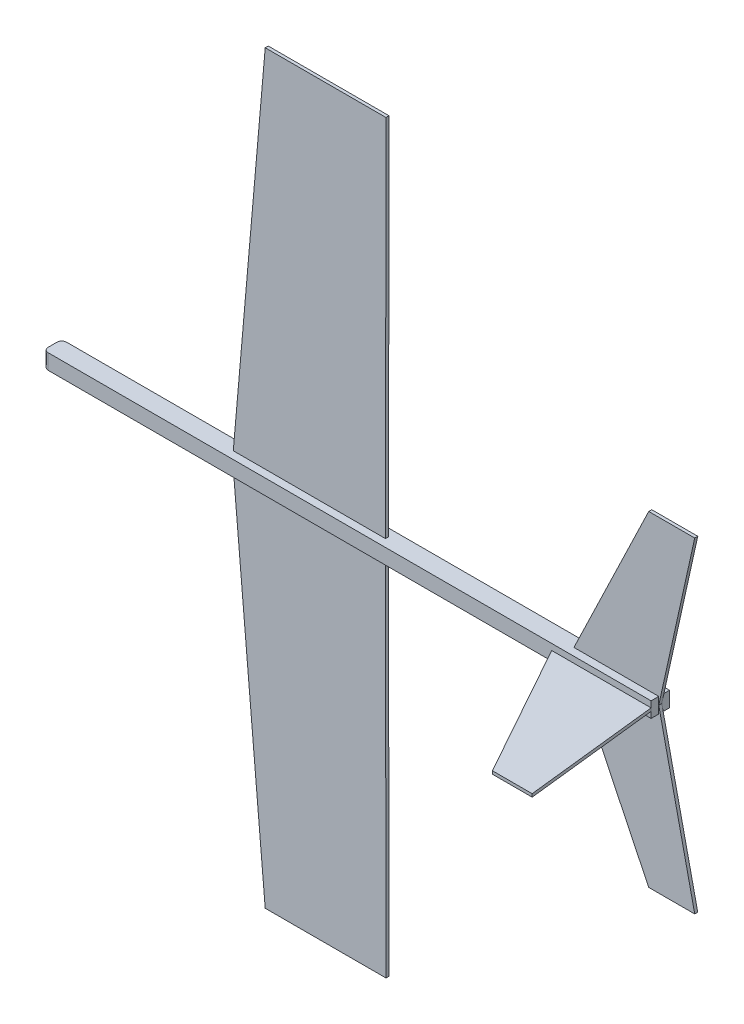
ISO-10303-21;
HEADER;
FILE_DESCRIPTION(('STEP AP214'),'2;1');
FILE_NAME('part.step','',(''),(''),'','','');
FILE_SCHEMA(('AUTOMOTIVE_DESIGN { 1 0 10303 214 1 1 1 1 }'));
ENDSEC;
DATA;
#1=APPLICATION_CONTEXT('core data for automotive mechanical design processes');
#2=APPLICATION_PROTOCOL_DEFINITION('international standard','automotive_design',2000,#1);
#3=PRODUCT_CONTEXT('',#1,'mechanical');
#4=PRODUCT('Part','Part','',(#3));
#5=PRODUCT_RELATED_PRODUCT_CATEGORY('part','',(#4));
#6=PRODUCT_DEFINITION_FORMATION('','',#4);
#7=PRODUCT_DEFINITION_CONTEXT('part definition',#1,'design');
#8=PRODUCT_DEFINITION('design','',#6,#7);
#9=PRODUCT_DEFINITION_SHAPE('','',#8);
#10=(LENGTH_UNIT() NAMED_UNIT(*) SI_UNIT(.MILLI.,.METRE.));
#11=(NAMED_UNIT(*) PLANE_ANGLE_UNIT() SI_UNIT($,.RADIAN.));
#12=(NAMED_UNIT(*) SI_UNIT($,.STERADIAN.) SOLID_ANGLE_UNIT());
#13=UNCERTAINTY_MEASURE_WITH_UNIT(LENGTH_MEASURE(1.E-05),#10,'distance_accuracy_value','');
#14=(GEOMETRIC_REPRESENTATION_CONTEXT(3) GLOBAL_UNCERTAINTY_ASSIGNED_CONTEXT((#13)) GLOBAL_UNIT_ASSIGNED_CONTEXT((#10,
#11,#12)) REPRESENTATION_CONTEXT('',''));
#15=CARTESIAN_POINT('',(0.,0.,0.));
#16=DIRECTION('',(0.,0.,1.));
#17=DIRECTION('',(1.,0.,0.));
#18=AXIS2_PLACEMENT_3D('',#15,#16,#17);
#19=CARTESIAN_POINT('',(159.,4.00000000000003,4.8));
#20=DIRECTION('',(-1.,0.,0.));
#21=DIRECTION('',(0.,0.,1.));
#22=AXIS2_PLACEMENT_3D('',#19,#20,#21);
#23=PLANE('',#22);
#24=DIRECTION('',(0.,1.,0.));
#25=VECTOR('',#24,1.);
#26=CARTESIAN_POINT('',(159.,4.00000000000003,-0.79375));
#27=LINE('',#26,#25);
#28=CARTESIAN_POINT('',(159.,-3.99999999999997,-0.79375));
#29=VERTEX_POINT('',#28);
#30=CARTESIAN_POINT('',(159.,0.,-0.79375));
#31=VERTEX_POINT('',#30);
#32=EDGE_CURVE('E424',#29,#31,#27,.T.);
#33=ORIENTED_EDGE('',*,*,#32,.F.);
#34=DIRECTION('',(0.,0.,-1.));
#35=VECTOR('',#34,1.);
#36=CARTESIAN_POINT('',(159.,-3.99999999999997,4.8));
#37=LINE('',#36,#35);
#38=CARTESIAN_POINT('',(159.,-3.99999999999997,-4.8));
#39=VERTEX_POINT('',#38);
#40=EDGE_CURVE('E388',#29,#39,#37,.T.);
#41=ORIENTED_EDGE('',*,*,#40,.T.);
#42=DIRECTION('',(0.,1.,0.));
#43=VECTOR('',#42,1.);
#44=CARTESIAN_POINT('',(159.,4.00000000000003,-4.8));
#45=LINE('',#44,#43);
#46=CARTESIAN_POINT('',(159.,4.00000000000003,-4.8));
#47=VERTEX_POINT('',#46);
#48=EDGE_CURVE('E378',#39,#47,#45,.T.);
#49=ORIENTED_EDGE('',*,*,#48,.T.);
#50=DIRECTION('',(0.,0.,-1.));
#51=VECTOR('',#50,1.);
#52=CARTESIAN_POINT('',(159.,4.00000000000003,4.8));
#53=LINE('',#52,#51);
#54=CARTESIAN_POINT('',(159.,4.00000000000003,-0.79375));
#55=VERTEX_POINT('',#54);
#56=EDGE_CURVE('E384',#55,#47,#53,.T.);
#57=ORIENTED_EDGE('',*,*,#56,.F.);
#58=DIRECTION('',(0.,1.,0.));
#59=VECTOR('',#58,1.);
#60=CARTESIAN_POINT('',(159.,4.00000000000003,-0.79375));
#61=LINE('',#60,#59);
#62=EDGE_CURVE('E416',#31,#55,#61,.T.);
#63=ORIENTED_EDGE('',*,*,#62,.F.);
#64=EDGE_LOOP('',(#33,#41,#49,#57,#63));
#65=FACE_BOUND('',#64,.T.);
#66=ADVANCED_FACE('F43',(#65),#23,.F.);
#67=CARTESIAN_POINT('',(0.,0.,4.8));
#68=DIRECTION('',(0.,0.,-1.));
#69=DIRECTION('',(-1.,0.,0.));
#70=AXIS2_PLACEMENT_3D('',#67,#68,#69);
#71=PLANE('',#70);
#72=DIRECTION('',(-1.,0.,0.));
#73=VECTOR('',#72,1.);
#74=CARTESIAN_POINT('',(159.,4.00000000000003,4.8));
#75=LINE('',#74,#73);
#76=CARTESIAN_POINT('',(159.,4.00000000000003,4.8));
#77=VERTEX_POINT('',#76);
#78=CARTESIAN_POINT('',(-156.5,4.00000000000007,4.8));
#79=VERTEX_POINT('',#78);
#80=EDGE_CURVE('E374',#77,#79,#75,.T.);
#81=ORIENTED_EDGE('',*,*,#80,.T.);
#82=DIRECTION('',(0.,-1.,0.));
#83=VECTOR('',#82,1.);
#84=CARTESIAN_POINT('',(-156.5,0.,4.8));
#85=LINE('',#84,#83);
#86=CARTESIAN_POINT('',(-156.5,-4.00000000000007,4.8));
#87=VERTEX_POINT('',#86);
#88=EDGE_CURVE('E11',#79,#87,#85,.T.);
#89=ORIENTED_EDGE('',*,*,#88,.T.);
#90=DIRECTION('',(1.,0.,0.));
#91=VECTOR('',#90,1.);
#92=CARTESIAN_POINT('',(159.,-3.99999999999997,4.8));
#93=LINE('',#92,#91);
#94=CARTESIAN_POINT('',(159.,-3.99999999999997,4.8));
#95=VERTEX_POINT('',#94);
#96=EDGE_CURVE('E367',#87,#95,#93,.T.);
#97=ORIENTED_EDGE('',*,*,#96,.T.);
#98=DIRECTION('',(0.,1.,0.));
#99=VECTOR('',#98,1.);
#100=CARTESIAN_POINT('',(159.,4.00000000000003,4.8));
#101=LINE('',#100,#99);
#102=CARTESIAN_POINT('',(159.,-0.79375,4.8));
#103=VERTEX_POINT('',#102);
#104=EDGE_CURVE('E371',#95,#103,#101,.T.);
#105=ORIENTED_EDGE('',*,*,#104,.T.);
#106=DIRECTION('',(1.,0.,0.));
#107=VECTOR('',#106,1.);
#108=CARTESIAN_POINT('',(107.,-0.79375,4.8));
#109=LINE('',#108,#107);
#110=CARTESIAN_POINT('',(107.,-0.79375,4.8));
#111=VERTEX_POINT('',#110);
#112=EDGE_CURVE('E291',#111,#103,#109,.T.);
#113=ORIENTED_EDGE('',*,*,#112,.F.);
#114=DIRECTION('',(0.,-1.,0.));
#115=VECTOR('',#114,1.);
#116=CARTESIAN_POINT('',(107.,0.79375,4.8));
#117=LINE('',#116,#115);
#118=CARTESIAN_POINT('',(107.,0.79375,4.8));
#119=VERTEX_POINT('',#118);
#120=EDGE_CURVE('E316',#119,#111,#117,.T.);
#121=ORIENTED_EDGE('',*,*,#120,.F.);
#122=DIRECTION('',(1.,0.,0.));
#123=VECTOR('',#122,1.);
#124=CARTESIAN_POINT('',(107.,0.79375,4.8));
#125=LINE('',#124,#123);
#126=CARTESIAN_POINT('',(159.,0.79375,4.8));
#127=VERTEX_POINT('',#126);
#128=EDGE_CURVE('E292',#119,#127,#125,.T.);
#129=ORIENTED_EDGE('',*,*,#128,.T.);
#130=EDGE_CURVE('E369',#127,#77,#101,.T.);
#131=ORIENTED_EDGE('',*,*,#130,.T.);
#132=EDGE_LOOP('',(#81,#89,#97,#105,#113,#121,#129,#131));
#133=FACE_BOUND('',#132,.T.);
#134=ADVANCED_FACE('F503',(#133),#71,.F.);
#135=CARTESIAN_POINT('',(159.,-3.99999999999997,4.8));
#136=DIRECTION('',(0.,1.,0.));
#137=DIRECTION('',(-1.,0.,0.));
#138=AXIS2_PLACEMENT_3D('',#135,#136,#137);
#139=PLANE('',#138);
#140=DIRECTION('',(0.,0.,-1.));
#141=VECTOR('',#140,1.);
#142=CARTESIAN_POINT('',(-159.,-4.00000000000007,4.8));
#143=LINE('',#142,#141);
#144=CARTESIAN_POINT('',(-159.,-4.00000000000007,2.3));
#145=VERTEX_POINT('',#144);
#146=CARTESIAN_POINT('',(-159.,-4.00000000000007,-2.3));
#147=VERTEX_POINT('',#146);
#148=EDGE_CURVE('E392',#145,#147,#143,.T.);
#149=ORIENTED_EDGE('',*,*,#148,.T.);
#150=CARTESIAN_POINT('',(-156.5,-4.00000000000007,-2.3));
#151=DIRECTION('',(0.,1.,0.));
#152=DIRECTION('',(-1.,0.,0.));
#153=AXIS2_PLACEMENT_3D('',#150,#151,#152);
#154=CIRCLE('',#153,2.5);
#155=CARTESIAN_POINT('',(-156.5,-4.00000000000007,-4.8));
#156=VERTEX_POINT('',#155);
#157=EDGE_CURVE('E439',#147,#156,#154,.F.);
#158=ORIENTED_EDGE('',*,*,#157,.T.);
#159=DIRECTION('',(1.,0.,0.));
#160=VECTOR('',#159,1.);
#161=CARTESIAN_POINT('',(159.,-3.99999999999997,-4.8));
#162=LINE('',#161,#160);
#163=EDGE_CURVE('E365',#156,#39,#162,.T.);
#164=ORIENTED_EDGE('',*,*,#163,.T.);
#165=ORIENTED_EDGE('',*,*,#40,.F.);
#166=DIRECTION('',(1.,0.,0.));
#167=VECTOR('',#166,1.);
#168=CARTESIAN_POINT('',(159.,-3.99999999999997,-0.79375));
#169=LINE('',#168,#167);
#170=CARTESIAN_POINT('',(114.627650142541,-3.99999999999999,-0.79375));
#171=VERTEX_POINT('',#170);
#172=EDGE_CURVE('E237',#171,#29,#169,.T.);
#173=ORIENTED_EDGE('',*,*,#172,.F.);
#174=DIRECTION('',(0.,0.,1.));
#175=VECTOR('',#174,1.);
#176=CARTESIAN_POINT('',(114.627650142541,-3.99999999999998,4.8));
#177=LINE('',#176,#175);
#178=CARTESIAN_POINT('',(114.627650142541,-3.99999999999999,0.79375));
#179=VERTEX_POINT('',#178);
#180=EDGE_CURVE('E430',#171,#179,#177,.T.);
#181=ORIENTED_EDGE('',*,*,#180,.T.);
#182=DIRECTION('',(1.,0.,0.));
#183=VECTOR('',#182,1.);
#184=CARTESIAN_POINT('',(159.,-3.99999999999997,0.79375));
#185=LINE('',#184,#183);
#186=CARTESIAN_POINT('',(159.,-3.99999999999997,0.79375));
#187=VERTEX_POINT('',#186);
#188=EDGE_CURVE('E247',#179,#187,#185,.T.);
#189=ORIENTED_EDGE('',*,*,#188,.T.);
#190=EDGE_CURVE('E389',#95,#187,#37,.T.);
#191=ORIENTED_EDGE('',*,*,#190,.F.);
#192=ORIENTED_EDGE('',*,*,#96,.F.);
#193=CARTESIAN_POINT('',(-156.5,-4.00000000000007,2.3));
#194=DIRECTION('',(0.,1.,0.));
#195=DIRECTION('',(-1.,0.,0.));
#196=AXIS2_PLACEMENT_3D('',#193,#194,#195);
#197=CIRCLE('',#196,2.5);
#198=EDGE_CURVE('E437',#87,#145,#197,.F.);
#199=ORIENTED_EDGE('',*,*,#198,.T.);
#200=EDGE_LOOP('',(#149,#158,#164,#165,#173,#181,#189,#191,#192,#199));
#201=FACE_BOUND('',#200,.T.);
#202=DIRECTION('',(-1.,0.,0.));
#203=VECTOR('',#202,1.);
#204=CARTESIAN_POINT('',(159.,-3.99999999999997,0.79375));
#205=LINE('',#204,#203);
#206=CARTESIAN_POINT('',(16.0053392694884,-4.00000000000004,0.79375));
#207=VERTEX_POINT('',#206);
#208=CARTESIAN_POINT('',(-63.6500453458962,-4.00000000000004,0.79375));
#209=VERTEX_POINT('',#208);
#210=EDGE_CURVE('E414',#207,#209,#205,.T.);
#211=ORIENTED_EDGE('',*,*,#210,.F.);
#212=DIRECTION('',(0.,0.,1.));
#213=VECTOR('',#212,1.);
#214=CARTESIAN_POINT('',(16.0053392694884,-4.00000000000002,4.8));
#215=LINE('',#214,#213);
#216=CARTESIAN_POINT('',(16.0053392694884,-4.00000000000004,-0.79375));
#217=VERTEX_POINT('',#216);
#218=EDGE_CURVE('E412',#217,#207,#215,.T.);
#219=ORIENTED_EDGE('',*,*,#218,.F.);
#220=DIRECTION('',(-1.,0.,0.));
#221=VECTOR('',#220,1.);
#222=CARTESIAN_POINT('',(159.,-3.99999999999997,-0.79375));
#223=LINE('',#222,#221);
#224=CARTESIAN_POINT('',(-63.6500453458962,-4.00000000000004,-0.79375));
#225=VERTEX_POINT('',#224);
#226=EDGE_CURVE('E406',#217,#225,#223,.T.);
#227=ORIENTED_EDGE('',*,*,#226,.T.);
#228=DIRECTION('',(0.,0.,-1.));
#229=VECTOR('',#228,1.);
#230=CARTESIAN_POINT('',(-63.6500453458962,-4.00000000000004,4.8));
#231=LINE('',#230,#229);
#232=EDGE_CURVE('E409',#209,#225,#231,.T.);
#233=ORIENTED_EDGE('',*,*,#232,.F.);
#234=EDGE_LOOP('',(#211,#219,#227,#233));
#235=FACE_BOUND('',#234,.T.);
#236=ADVANCED_FACE('F453',(#201,#235),#139,.F.);
#237=CARTESIAN_POINT('',(159.,4.00000000000003,4.8));
#238=DIRECTION('',(0.,-1.,0.));
#239=DIRECTION('',(1.,0.,0.));
#240=AXIS2_PLACEMENT_3D('',#237,#238,#239);
#241=PLANE('',#240);
#242=DIRECTION('',(-1.,0.,0.));
#243=VECTOR('',#242,1.);
#244=CARTESIAN_POINT('',(159.,4.00000000000003,-4.8));
#245=LINE('',#244,#243);
#246=CARTESIAN_POINT('',(-156.5,4.00000000000007,-4.8));
#247=VERTEX_POINT('',#246);
#248=EDGE_CURVE('E370',#47,#247,#245,.T.);
#249=ORIENTED_EDGE('',*,*,#248,.T.);
#250=CARTESIAN_POINT('',(-156.5,4.00000000000007,-2.3));
#251=DIRECTION('',(0.,-1.,0.));
#252=DIRECTION('',(1.,0.,0.));
#253=AXIS2_PLACEMENT_3D('',#250,#251,#252);
#254=CIRCLE('',#253,2.5);
#255=CARTESIAN_POINT('',(-159.,4.00000000000007,-2.3));
#256=VERTEX_POINT('',#255);
#257=EDGE_CURVE('E51',#247,#256,#254,.F.);
#258=ORIENTED_EDGE('',*,*,#257,.T.);
#259=DIRECTION('',(0.,0.,-1.));
#260=VECTOR('',#259,1.);
#261=CARTESIAN_POINT('',(-159.,4.00000000000007,4.8));
#262=LINE('',#261,#260);
#263=CARTESIAN_POINT('',(-159.,4.00000000000007,2.3));
#264=VERTEX_POINT('',#263);
#265=EDGE_CURVE('E376',#264,#256,#262,.T.);
#266=ORIENTED_EDGE('',*,*,#265,.F.);
#267=CARTESIAN_POINT('',(-156.5,4.00000000000007,2.3));
#268=DIRECTION('',(0.,-1.,0.));
#269=DIRECTION('',(1.,0.,0.));
#270=AXIS2_PLACEMENT_3D('',#267,#268,#269);
#271=CIRCLE('',#270,2.5);
#272=EDGE_CURVE('E58',#264,#79,#271,.F.);
#273=ORIENTED_EDGE('',*,*,#272,.T.);
#274=ORIENTED_EDGE('',*,*,#80,.F.);
#275=CARTESIAN_POINT('',(159.,4.00000000000003,0.79375));
#276=VERTEX_POINT('',#275);
#277=EDGE_CURVE('E385',#77,#276,#53,.T.);
#278=ORIENTED_EDGE('',*,*,#277,.T.);
#279=DIRECTION('',(-1.,0.,0.));
#280=VECTOR('',#279,1.);
#281=CARTESIAN_POINT('',(159.,4.00000000000003,0.79375));
#282=LINE('',#281,#280);
#283=CARTESIAN_POINT('',(114.627650142541,4.00000000000003,0.79375));
#284=VERTEX_POINT('',#283);
#285=EDGE_CURVE('E289',#276,#284,#282,.T.);
#286=ORIENTED_EDGE('',*,*,#285,.T.);
#287=DIRECTION('',(0.,0.,1.));
#288=VECTOR('',#287,1.);
#289=CARTESIAN_POINT('',(114.627650142541,4.00000000000003,4.8));
#290=LINE('',#289,#288);
#291=CARTESIAN_POINT('',(114.627650142541,4.00000000000003,-0.79375));
#292=VERTEX_POINT('',#291);
#293=EDGE_CURVE('E421',#292,#284,#290,.T.);
#294=ORIENTED_EDGE('',*,*,#293,.F.);
#295=DIRECTION('',(-1.,0.,0.));
#296=VECTOR('',#295,1.);
#297=CARTESIAN_POINT('',(159.,4.00000000000003,-0.79375));
#298=LINE('',#297,#296);
#299=EDGE_CURVE('E286',#55,#292,#298,.T.);
#300=ORIENTED_EDGE('',*,*,#299,.F.);
#301=ORIENTED_EDGE('',*,*,#56,.T.);
#302=EDGE_LOOP('',(#249,#258,#266,#273,#274,#278,#286,#294,#300,#301));
#303=FACE_BOUND('',#302,.T.);
#304=DIRECTION('',(1.,0.,0.));
#305=VECTOR('',#304,1.);
#306=CARTESIAN_POINT('',(159.,4.00000000000003,0.79375));
#307=LINE('',#306,#305);
#308=CARTESIAN_POINT('',(-63.6500453458962,4.00000000000006,0.79375));
#309=VERTEX_POINT('',#308);
#310=CARTESIAN_POINT('',(16.0053392694884,4.00000000000007,0.79375));
#311=VERTEX_POINT('',#310);
#312=EDGE_CURVE('E404',#309,#311,#307,.T.);
#313=ORIENTED_EDGE('',*,*,#312,.F.);
#314=DIRECTION('',(0.,0.,-1.));
#315=VECTOR('',#314,1.);
#316=CARTESIAN_POINT('',(-63.6500453458962,4.00000000000006,4.8));
#317=LINE('',#316,#315);
#318=CARTESIAN_POINT('',(-63.6500453458962,4.00000000000006,-0.79375));
#319=VERTEX_POINT('',#318);
#320=EDGE_CURVE('E401',#309,#319,#317,.T.);
#321=ORIENTED_EDGE('',*,*,#320,.T.);
#322=DIRECTION('',(1.,0.,0.));
#323=VECTOR('',#322,1.);
#324=CARTESIAN_POINT('',(159.,4.00000000000003,-0.79375));
#325=LINE('',#324,#323);
#326=CARTESIAN_POINT('',(16.0053392694884,4.00000000000007,-0.79375));
#327=VERTEX_POINT('',#326);
#328=EDGE_CURVE('E395',#319,#327,#325,.T.);
#329=ORIENTED_EDGE('',*,*,#328,.T.);
#330=DIRECTION('',(0.,0.,1.));
#331=VECTOR('',#330,1.);
#332=CARTESIAN_POINT('',(16.0053392694884,4.00000000000005,4.8));
#333=LINE('',#332,#331);
#334=EDGE_CURVE('E398',#327,#311,#333,.T.);
#335=ORIENTED_EDGE('',*,*,#334,.T.);
#336=EDGE_LOOP('',(#313,#321,#329,#335));
#337=FACE_BOUND('',#336,.T.);
#338=ADVANCED_FACE('F443',(#303,#337),#241,.F.);
#339=CARTESIAN_POINT('',(-159.,4.00000000000007,4.8));
#340=DIRECTION('',(1.,0.,0.));
#341=DIRECTION('',(0.,0.,-1.));
#342=AXIS2_PLACEMENT_3D('',#339,#340,#341);
#343=PLANE('',#342);
#344=ORIENTED_EDGE('',*,*,#265,.T.);
#345=DIRECTION('',(0.,-1.,0.));
#346=VECTOR('',#345,1.);
#347=CARTESIAN_POINT('',(-159.,-4.00000000000007,-2.3));
#348=LINE('',#347,#346);
#349=EDGE_CURVE('E434',#256,#147,#348,.T.);
#350=ORIENTED_EDGE('',*,*,#349,.T.);
#351=ORIENTED_EDGE('',*,*,#148,.F.);
#352=DIRECTION('',(0.,-1.,0.));
#353=VECTOR('',#352,1.);
#354=CARTESIAN_POINT('',(-159.,4.00000000000007,2.3));
#355=LINE('',#354,#353);
#356=EDGE_CURVE('E432',#145,#264,#355,.F.);
#357=ORIENTED_EDGE('',*,*,#356,.T.);
#358=EDGE_LOOP('',(#344,#350,#351,#357));
#359=FACE_BOUND('',#358,.T.);
#360=ADVANCED_FACE('F448',(#359),#343,.F.);
#361=ORIENTED_EDGE('',*,*,#190,.T.);
#362=DIRECTION('',(0.,1.,0.));
#363=VECTOR('',#362,1.);
#364=CARTESIAN_POINT('',(159.,4.00000000000003,0.79375));
#365=LINE('',#364,#363);
#366=CARTESIAN_POINT('',(159.,0.,0.79375));
#367=VERTEX_POINT('',#366);
#368=EDGE_CURVE('E427',#187,#367,#365,.T.);
#369=ORIENTED_EDGE('',*,*,#368,.T.);
#370=DIRECTION('',(0.,1.,0.));
#371=VECTOR('',#370,1.);
#372=CARTESIAN_POINT('',(159.,4.00000000000003,0.79375));
#373=LINE('',#372,#371);
#374=EDGE_CURVE('E419',#367,#276,#373,.T.);
#375=ORIENTED_EDGE('',*,*,#374,.T.);
#376=ORIENTED_EDGE('',*,*,#277,.F.);
#377=ORIENTED_EDGE('',*,*,#130,.F.);
#378=DIRECTION('',(0.,-1.,0.));
#379=VECTOR('',#378,1.);
#380=CARTESIAN_POINT('',(159.,0.79375,4.8));
#381=LINE('',#380,#379);
#382=EDGE_CURVE('E305',#127,#103,#381,.T.);
#383=ORIENTED_EDGE('',*,*,#382,.T.);
#384=ORIENTED_EDGE('',*,*,#104,.F.);
#385=EDGE_LOOP('',(#361,#369,#375,#376,#377,#383,#384));
#386=FACE_BOUND('',#385,.T.);
#387=ADVANCED_FACE('F470',(#386),#23,.F.);
#388=CARTESIAN_POINT('',(0.,0.,-4.8));
#389=DIRECTION('',(0.,0.,-1.));
#390=DIRECTION('',(-1.,0.,0.));
#391=AXIS2_PLACEMENT_3D('',#388,#389,#390);
#392=PLANE('',#391);
#393=ORIENTED_EDGE('',*,*,#163,.F.);
#394=DIRECTION('',(0.,-1.,0.));
#395=VECTOR('',#394,1.);
#396=CARTESIAN_POINT('',(-156.5,4.00000000000007,-4.8));
#397=LINE('',#396,#395);
#398=EDGE_CURVE('E66',#156,#247,#397,.F.);
#399=ORIENTED_EDGE('',*,*,#398,.T.);
#400=ORIENTED_EDGE('',*,*,#248,.F.);
#401=ORIENTED_EDGE('',*,*,#48,.F.);
#402=EDGE_LOOP('',(#393,#399,#400,#401));
#403=FACE_BOUND('',#402,.T.);
#404=ADVANCED_FACE('F458',(#403),#392,.T.);
#405=CARTESIAN_POINT('',(-63.9999999999999,0.,0.79375));
#406=DIRECTION('',(-0.996194698091745,0.0871557427476617,0.));
#407=DIRECTION('',(-0.0871557427476617,-0.996194698091745,0.));
#408=AXIS2_PLACEMENT_3D('',#405,#406,#407);
#409=PLANE('',#408);
#410=ORIENTED_EDGE('',*,*,#320,.F.);
#411=DIRECTION('',(0.0871557427476617,0.996194698091745,0.));
#412=VECTOR('',#411,1.);
#413=CARTESIAN_POINT('',(-63.9999999999999,0.,0.79375));
#414=LINE('',#413,#412);
#415=CARTESIAN_POINT('',(-46.9397106124441,195.,0.79375));
#416=VERTEX_POINT('',#415);
#417=EDGE_CURVE('E354',#309,#416,#414,.T.);
#418=ORIENTED_EDGE('',*,*,#417,.T.);
#419=DIRECTION('',(0.,0.,-1.));
#420=VECTOR('',#419,1.);
#421=CARTESIAN_POINT('',(-46.9397106124441,195.,0.79375));
#422=LINE('',#421,#420);
#423=CARTESIAN_POINT('',(-46.9397106124441,195.,-0.79375));
#424=VERTEX_POINT('',#423);
#425=EDGE_CURVE('E362',#416,#424,#422,.T.);
#426=ORIENTED_EDGE('',*,*,#425,.T.);
#427=DIRECTION('',(0.0871557427476617,0.996194698091745,0.));
#428=VECTOR('',#427,1.);
#429=CARTESIAN_POINT('',(-63.9999999999999,0.,-0.79375));
#430=LINE('',#429,#428);
#431=EDGE_CURVE('E351',#319,#424,#430,.T.);
#432=ORIENTED_EDGE('',*,*,#431,.F.);
#433=EDGE_LOOP('',(#410,#418,#426,#432));
#434=FACE_BOUND('',#433,.T.);
#435=ADVANCED_FACE('F517',(#434),#409,.T.);
#436=CARTESIAN_POINT('',(16.2602893875559,195.,0.79375));
#437=DIRECTION('',(0.999999109132482,-0.00133481618293596,0.));
#438=DIRECTION('',(0.00133481618293596,0.999999109132482,0.));
#439=AXIS2_PLACEMENT_3D('',#436,#437,#438);
#440=PLANE('',#439);
#441=ORIENTED_EDGE('',*,*,#334,.F.);
#442=DIRECTION('',(-0.00133481618293596,-0.999999109132482,0.));
#443=VECTOR('',#442,1.);
#444=CARTESIAN_POINT('',(16.2602893875559,195.,-0.79375));
#445=LINE('',#444,#443);
#446=CARTESIAN_POINT('',(16.2602893875559,195.,-0.79375));
#447=VERTEX_POINT('',#446);
#448=EDGE_CURVE('E359',#447,#327,#445,.T.);
#449=ORIENTED_EDGE('',*,*,#448,.F.);
#450=DIRECTION('',(0.,0.,-1.));
#451=VECTOR('',#450,1.);
#452=CARTESIAN_POINT('',(16.2602893875559,195.,0.79375));
#453=LINE('',#452,#451);
#454=CARTESIAN_POINT('',(16.2602893875559,195.,0.79375));
#455=VERTEX_POINT('',#454);
#456=EDGE_CURVE('E356',#455,#447,#453,.T.);
#457=ORIENTED_EDGE('',*,*,#456,.F.);
#458=DIRECTION('',(-0.00133481618293596,-0.999999109132482,0.));
#459=VECTOR('',#458,1.);
#460=CARTESIAN_POINT('',(16.2602893875559,195.,0.79375));
#461=LINE('',#460,#459);
#462=EDGE_CURVE('E350',#455,#311,#461,.T.);
#463=ORIENTED_EDGE('',*,*,#462,.T.);
#464=EDGE_LOOP('',(#441,#449,#457,#463));
#465=FACE_BOUND('',#464,.T.);
#466=ADVANCED_FACE('F592',(#465),#440,.T.);
#467=CARTESIAN_POINT('',(0.,0.,0.79375));
#468=DIRECTION('',(0.,0.,-1.));
#469=DIRECTION('',(-1.,0.,0.));
#470=AXIS2_PLACEMENT_3D('',#467,#468,#469);
#471=PLANE('',#470);
#472=ORIENTED_EDGE('',*,*,#417,.F.);
#473=ORIENTED_EDGE('',*,*,#312,.T.);
#474=ORIENTED_EDGE('',*,*,#462,.F.);
#475=DIRECTION('',(1.,0.,0.));
#476=VECTOR('',#475,1.);
#477=CARTESIAN_POINT('',(-46.9397106124441,195.,0.79375));
#478=LINE('',#477,#476);
#479=EDGE_CURVE('E347',#416,#455,#478,.T.);
#480=ORIENTED_EDGE('',*,*,#479,.F.);
#481=EDGE_LOOP('',(#472,#473,#474,#480));
#482=FACE_BOUND('',#481,.T.);
#483=ADVANCED_FACE('F588',(#482),#471,.F.);
#484=CARTESIAN_POINT('',(0.,0.,-0.79375));
#485=DIRECTION('',(0.,0.,-1.));
#486=DIRECTION('',(-1.,0.,0.));
#487=AXIS2_PLACEMENT_3D('',#484,#485,#486);
#488=PLANE('',#487);
#489=ORIENTED_EDGE('',*,*,#328,.F.);
#490=ORIENTED_EDGE('',*,*,#431,.T.);
#491=DIRECTION('',(1.,0.,0.));
#492=VECTOR('',#491,1.);
#493=CARTESIAN_POINT('',(-46.9397106124441,195.,-0.79375));
#494=LINE('',#493,#492);
#495=EDGE_CURVE('E344',#424,#447,#494,.T.);
#496=ORIENTED_EDGE('',*,*,#495,.T.);
#497=ORIENTED_EDGE('',*,*,#448,.T.);
#498=EDGE_LOOP('',(#489,#490,#496,#497));
#499=FACE_BOUND('',#498,.T.);
#500=ADVANCED_FACE('F591',(#499),#488,.T.);
#501=CARTESIAN_POINT('',(-46.9397106124441,195.,0.79375));
#502=DIRECTION('',(0.,1.,0.));
#503=DIRECTION('',(0.,0.,1.));
#504=AXIS2_PLACEMENT_3D('',#501,#502,#503);
#505=PLANE('',#504);
#506=ORIENTED_EDGE('',*,*,#495,.F.);
#507=ORIENTED_EDGE('',*,*,#425,.F.);
#508=ORIENTED_EDGE('',*,*,#479,.T.);
#509=ORIENTED_EDGE('',*,*,#456,.T.);
#510=EDGE_LOOP('',(#506,#507,#508,#509));
#511=FACE_BOUND('',#510,.T.);
#512=ADVANCED_FACE('F580',(#511),#505,.T.);
#513=CARTESIAN_POINT('',(16.2602893875559,-195.,0.79375));
#514=DIRECTION('',(-0.999999109132482,-0.00133481618293596,0.));
#515=DIRECTION('',(0.00133481618293596,-0.999999109132482,0.));
#516=AXIS2_PLACEMENT_3D('',#513,#514,#515);
#517=PLANE('',#516);
#518=DIRECTION('',(-0.00133481618293596,0.999999109132482,0.));
#519=VECTOR('',#518,1.);
#520=CARTESIAN_POINT('',(16.2602893875559,-195.,-0.79375));
#521=LINE('',#520,#519);
#522=CARTESIAN_POINT('',(16.2602893875559,-195.,-0.79375));
#523=VERTEX_POINT('',#522);
#524=EDGE_CURVE('E329',#523,#217,#521,.T.);
#525=ORIENTED_EDGE('',*,*,#524,.T.);
#526=ORIENTED_EDGE('',*,*,#218,.T.);
#527=DIRECTION('',(-0.00133481618293596,0.999999109132482,0.));
#528=VECTOR('',#527,1.);
#529=CARTESIAN_POINT('',(16.2602893875559,-195.,0.79375));
#530=LINE('',#529,#528);
#531=CARTESIAN_POINT('',(16.2602893875559,-195.,0.79375));
#532=VERTEX_POINT('',#531);
#533=EDGE_CURVE('E331',#532,#207,#530,.T.);
#534=ORIENTED_EDGE('',*,*,#533,.F.);
#535=DIRECTION('',(0.,0.,-1.));
#536=VECTOR('',#535,1.);
#537=CARTESIAN_POINT('',(16.2602893875559,-195.,0.79375));
#538=LINE('',#537,#536);
#539=EDGE_CURVE('E341',#532,#523,#538,.T.);
#540=ORIENTED_EDGE('',*,*,#539,.T.);
#541=EDGE_LOOP('',(#525,#526,#534,#540));
#542=FACE_BOUND('',#541,.T.);
#543=ADVANCED_FACE('F577',(#542),#517,.F.);
#544=CARTESIAN_POINT('',(-63.9999999999999,0.,0.79375));
#545=DIRECTION('',(0.996194698091745,0.0871557427476617,0.));
#546=DIRECTION('',(-0.0871557427476617,0.996194698091745,0.));
#547=AXIS2_PLACEMENT_3D('',#544,#545,#546);
#548=PLANE('',#547);
#549=DIRECTION('',(0.0871557427476617,-0.996194698091745,0.));
#550=VECTOR('',#549,1.);
#551=CARTESIAN_POINT('',(-63.9999999999999,0.,0.79375));
#552=LINE('',#551,#550);
#553=CARTESIAN_POINT('',(-46.9397106124441,-195.,0.79375));
#554=VERTEX_POINT('',#553);
#555=EDGE_CURVE('E328',#209,#554,#552,.T.);
#556=ORIENTED_EDGE('',*,*,#555,.F.);
#557=ORIENTED_EDGE('',*,*,#232,.T.);
#558=DIRECTION('',(0.0871557427476617,-0.996194698091745,0.));
#559=VECTOR('',#558,1.);
#560=CARTESIAN_POINT('',(-63.9999999999999,0.,-0.79375));
#561=LINE('',#560,#559);
#562=CARTESIAN_POINT('',(-46.9397106124441,-195.,-0.79375));
#563=VERTEX_POINT('',#562);
#564=EDGE_CURVE('E337',#225,#563,#561,.T.);
#565=ORIENTED_EDGE('',*,*,#564,.T.);
#566=DIRECTION('',(0.,0.,-1.));
#567=VECTOR('',#566,1.);
#568=CARTESIAN_POINT('',(-46.9397106124441,-195.,0.79375));
#569=LINE('',#568,#567);
#570=EDGE_CURVE('E334',#554,#563,#569,.T.);
#571=ORIENTED_EDGE('',*,*,#570,.F.);
#572=EDGE_LOOP('',(#556,#557,#565,#571));
#573=FACE_BOUND('',#572,.T.);
#574=ADVANCED_FACE('F572',(#573),#548,.F.);
#575=CARTESIAN_POINT('',(0.,0.,0.79375));
#576=DIRECTION('',(0.,0.,-1.));
#577=DIRECTION('',(-1.,0.,0.));
#578=AXIS2_PLACEMENT_3D('',#575,#576,#577);
#579=PLANE('',#578);
#580=ORIENTED_EDGE('',*,*,#533,.T.);
#581=ORIENTED_EDGE('',*,*,#210,.T.);
#582=ORIENTED_EDGE('',*,*,#555,.T.);
#583=DIRECTION('',(1.,0.,0.));
#584=VECTOR('',#583,1.);
#585=CARTESIAN_POINT('',(-46.9397106124441,-195.,0.79375));
#586=LINE('',#585,#584);
#587=EDGE_CURVE('E325',#554,#532,#586,.T.);
#588=ORIENTED_EDGE('',*,*,#587,.T.);
#589=EDGE_LOOP('',(#580,#581,#582,#588));
#590=FACE_BOUND('',#589,.T.);
#591=ADVANCED_FACE('F568',(#590),#579,.F.);
#592=CARTESIAN_POINT('',(0.,0.,-0.79375));
#593=DIRECTION('',(0.,0.,-1.));
#594=DIRECTION('',(-1.,0.,0.));
#595=AXIS2_PLACEMENT_3D('',#592,#593,#594);
#596=PLANE('',#595);
#597=ORIENTED_EDGE('',*,*,#226,.F.);
#598=ORIENTED_EDGE('',*,*,#524,.F.);
#599=DIRECTION('',(1.,0.,0.));
#600=VECTOR('',#599,1.);
#601=CARTESIAN_POINT('',(-46.9397106124441,-195.,-0.79375));
#602=LINE('',#601,#600);
#603=EDGE_CURVE('E318',#563,#523,#602,.T.);
#604=ORIENTED_EDGE('',*,*,#603,.F.);
#605=ORIENTED_EDGE('',*,*,#564,.F.);
#606=EDGE_LOOP('',(#597,#598,#604,#605));
#607=FACE_BOUND('',#606,.T.);
#608=ADVANCED_FACE('F571',(#607),#596,.T.);
#609=CARTESIAN_POINT('',(-46.9397106124441,-195.,0.79375));
#610=DIRECTION('',(0.,1.,0.));
#611=DIRECTION('',(0.,0.,1.));
#612=AXIS2_PLACEMENT_3D('',#609,#610,#611);
#613=PLANE('',#612);
#614=ORIENTED_EDGE('',*,*,#603,.T.);
#615=ORIENTED_EDGE('',*,*,#539,.F.);
#616=ORIENTED_EDGE('',*,*,#587,.F.);
#617=ORIENTED_EDGE('',*,*,#570,.T.);
#618=EDGE_LOOP('',(#614,#615,#616,#617));
#619=FACE_BOUND('',#618,.T.);
#620=ADVANCED_FACE('F560',(#619),#613,.F.);
#621=CARTESIAN_POINT('',(145.966007971597,0.79375,74.8));
#622=DIRECTION('',(-0.873748311640368,0.,0.486378338236404));
#623=DIRECTION('',(0.486378338236404,0.,0.873748311640368));
#624=AXIS2_PLACEMENT_3D('',#621,#622,#623);
#625=PLANE('',#624);
#626=DIRECTION('',(-0.486378338236404,0.,-0.873748311640368));
#627=VECTOR('',#626,1.);
#628=CARTESIAN_POINT('',(145.966007971597,-0.79375,74.8));
#629=LINE('',#628,#627);
#630=CARTESIAN_POINT('',(145.966007971597,-0.79375,74.8));
#631=VERTEX_POINT('',#630);
#632=EDGE_CURVE('E296',#631,#111,#629,.T.);
#633=ORIENTED_EDGE('',*,*,#632,.F.);
#634=DIRECTION('',(0.,-1.,0.));
#635=VECTOR('',#634,1.);
#636=CARTESIAN_POINT('',(145.966007971597,0.79375,74.8));
#637=LINE('',#636,#635);
#638=CARTESIAN_POINT('',(145.966007971597,0.79375,74.8));
#639=VERTEX_POINT('',#638);
#640=EDGE_CURVE('E319',#639,#631,#637,.T.);
#641=ORIENTED_EDGE('',*,*,#640,.F.);
#642=DIRECTION('',(-0.486378338236404,0.,-0.873748311640368));
#643=VECTOR('',#642,1.);
#644=CARTESIAN_POINT('',(145.966007971597,0.79375,74.8));
#645=LINE('',#644,#643);
#646=EDGE_CURVE('E302',#639,#119,#645,.T.);
#647=ORIENTED_EDGE('',*,*,#646,.T.);
#648=ORIENTED_EDGE('',*,*,#120,.T.);
#649=EDGE_LOOP('',(#633,#641,#647,#648));
#650=FACE_BOUND('',#649,.T.);
#651=ADVANCED_FACE('F556',(#650),#625,.T.);
#652=CARTESIAN_POINT('',(166.766007971597,0.79375,74.8));
#653=DIRECTION('',(0.,0.,1.));
#654=DIRECTION('',(1.,0.,0.));
#655=AXIS2_PLACEMENT_3D('',#652,#653,#654);
#656=PLANE('',#655);
#657=DIRECTION('',(-1.,0.,0.));
#658=VECTOR('',#657,1.);
#659=CARTESIAN_POINT('',(166.766007971597,-0.79375,74.8));
#660=LINE('',#659,#658);
#661=CARTESIAN_POINT('',(166.766007971597,-0.79375,74.8));
#662=VERTEX_POINT('',#661);
#663=EDGE_CURVE('E311',#662,#631,#660,.T.);
#664=ORIENTED_EDGE('',*,*,#663,.F.);
#665=DIRECTION('',(0.,-1.,0.));
#666=VECTOR('',#665,1.);
#667=CARTESIAN_POINT('',(166.766007971597,0.79375,74.8));
#668=LINE('',#667,#666);
#669=CARTESIAN_POINT('',(166.766007971597,0.79375,74.8));
#670=VERTEX_POINT('',#669);
#671=EDGE_CURVE('E321',#670,#662,#668,.T.);
#672=ORIENTED_EDGE('',*,*,#671,.F.);
#673=DIRECTION('',(-1.,0.,0.));
#674=VECTOR('',#673,1.);
#675=CARTESIAN_POINT('',(166.766007971597,0.79375,74.8));
#676=LINE('',#675,#674);
#677=EDGE_CURVE('E299',#670,#639,#676,.T.);
#678=ORIENTED_EDGE('',*,*,#677,.T.);
#679=ORIENTED_EDGE('',*,*,#640,.T.);
#680=EDGE_LOOP('',(#664,#672,#678,#679));
#681=FACE_BOUND('',#680,.T.);
#682=ADVANCED_FACE('F559',(#681),#656,.T.);
#683=CARTESIAN_POINT('',(159.,0.79375,4.8));
#684=DIRECTION('',(0.99390206283076,0.,-0.110266447756153));
#685=DIRECTION('',(-0.110266447756153,0.,-0.99390206283076));
#686=AXIS2_PLACEMENT_3D('',#683,#684,#685);
#687=PLANE('',#686);
#688=DIRECTION('',(0.110266447756153,0.,0.99390206283076));
#689=VECTOR('',#688,1.);
#690=CARTESIAN_POINT('',(159.,-0.79375,4.8));
#691=LINE('',#690,#689);
#692=EDGE_CURVE('E308',#103,#662,#691,.T.);
#693=ORIENTED_EDGE('',*,*,#692,.F.);
#694=ORIENTED_EDGE('',*,*,#382,.F.);
#695=DIRECTION('',(0.110266447756153,0.,0.99390206283076));
#696=VECTOR('',#695,1.);
#697=CARTESIAN_POINT('',(159.,0.79375,4.8));
#698=LINE('',#697,#696);
#699=EDGE_CURVE('E295',#127,#670,#698,.T.);
#700=ORIENTED_EDGE('',*,*,#699,.T.);
#701=ORIENTED_EDGE('',*,*,#671,.T.);
#702=EDGE_LOOP('',(#693,#694,#700,#701));
#703=FACE_BOUND('',#702,.T.);
#704=ADVANCED_FACE('F551',(#703),#687,.T.);
#705=CARTESIAN_POINT('',(0.,0.79375,0.));
#706=DIRECTION('',(0.,-1.,0.));
#707=DIRECTION('',(0.,0.,-1.));
#708=AXIS2_PLACEMENT_3D('',#705,#706,#707);
#709=PLANE('',#708);
#710=ORIENTED_EDGE('',*,*,#128,.F.);
#711=ORIENTED_EDGE('',*,*,#646,.F.);
#712=ORIENTED_EDGE('',*,*,#677,.F.);
#713=ORIENTED_EDGE('',*,*,#699,.F.);
#714=EDGE_LOOP('',(#710,#711,#712,#713));
#715=FACE_BOUND('',#714,.T.);
#716=ADVANCED_FACE('F547',(#715),#709,.F.);
#717=CARTESIAN_POINT('',(0.,-0.79375,0.));
#718=DIRECTION('',(0.,-1.,0.));
#719=DIRECTION('',(0.,0.,-1.));
#720=AXIS2_PLACEMENT_3D('',#717,#718,#719);
#721=PLANE('',#720);
#722=ORIENTED_EDGE('',*,*,#112,.T.);
#723=ORIENTED_EDGE('',*,*,#692,.T.);
#724=ORIENTED_EDGE('',*,*,#663,.T.);
#725=ORIENTED_EDGE('',*,*,#632,.T.);
#726=EDGE_LOOP('',(#722,#723,#724,#725));
#727=FACE_BOUND('',#726,.T.);
#728=ADVANCED_FACE('F550',(#727),#721,.T.);
#729=CARTESIAN_POINT('',(153.758948036131,85.2,0.79375));
#730=DIRECTION('',(0.90084983444906,-0.434130827946026,0.));
#731=DIRECTION('',(0.434130827946026,0.90084983444906,0.));
#732=AXIS2_PLACEMENT_3D('',#729,#730,#731);
#733=PLANE('',#732);
#734=DIRECTION('',(-0.434130827946026,-0.90084983444906,0.));
#735=VECTOR('',#734,1.);
#736=CARTESIAN_POINT('',(153.758948036131,85.2,-0.79375));
#737=LINE('',#736,#735);
#738=CARTESIAN_POINT('',(153.758948036131,85.2,-0.79375));
#739=VERTEX_POINT('',#738);
#740=EDGE_CURVE('E267',#739,#292,#737,.T.);
#741=ORIENTED_EDGE('',*,*,#740,.T.);
#742=ORIENTED_EDGE('',*,*,#293,.T.);
#743=DIRECTION('',(-0.434130827946026,-0.90084983444906,0.));
#744=VECTOR('',#743,1.);
#745=CARTESIAN_POINT('',(153.758948036131,85.2,0.79375));
#746=LINE('',#745,#744);
#747=CARTESIAN_POINT('',(153.758948036131,85.2,0.79375));
#748=VERTEX_POINT('',#747);
#749=EDGE_CURVE('E269',#748,#284,#746,.T.);
#750=ORIENTED_EDGE('',*,*,#749,.F.);
#751=DIRECTION('',(0.,0.,-1.));
#752=VECTOR('',#751,1.);
#753=CARTESIAN_POINT('',(153.758948036131,85.2,0.79375));
#754=LINE('',#753,#752);
#755=EDGE_CURVE('E272',#748,#739,#754,.T.);
#756=ORIENTED_EDGE('',*,*,#755,.T.);
#757=EDGE_LOOP('',(#741,#742,#750,#756));
#758=FACE_BOUND('',#757,.T.);
#759=ADVANCED_FACE('F489',(#758),#733,.F.);
#760=CARTESIAN_POINT('',(0.,0.,0.79375));
#761=DIRECTION('',(0.,0.,1.));
#762=DIRECTION('',(1.,0.,0.));
#763=AXIS2_PLACEMENT_3D('',#760,#761,#762);
#764=PLANE('',#763);
#765=ORIENTED_EDGE('',*,*,#285,.F.);
#766=ORIENTED_EDGE('',*,*,#374,.F.);
#767=DIRECTION('',(0.215855852939906,0.976425240738678,0.));
#768=VECTOR('',#767,1.);
#769=CARTESIAN_POINT('',(159.,0.,0.79375));
#770=LINE('',#769,#768);
#771=CARTESIAN_POINT('',(177.834948036131,85.2,0.79375));
#772=VERTEX_POINT('',#771);
#773=EDGE_CURVE('E264',#367,#772,#770,.T.);
#774=ORIENTED_EDGE('',*,*,#773,.T.);
#775=DIRECTION('',(-1.,0.,0.));
#776=VECTOR('',#775,1.);
#777=CARTESIAN_POINT('',(177.834948036131,85.2,0.79375));
#778=LINE('',#777,#776);
#779=EDGE_CURVE('E266',#772,#748,#778,.T.);
#780=ORIENTED_EDGE('',*,*,#779,.T.);
#781=ORIENTED_EDGE('',*,*,#749,.T.);
#782=EDGE_LOOP('',(#765,#766,#774,#780,#781));
#783=FACE_BOUND('',#782,.T.);
#784=ADVANCED_FACE('F477',(#783),#764,.T.);
#785=CARTESIAN_POINT('',(0.,0.,-0.79375));
#786=DIRECTION('',(0.,0.,1.));
#787=DIRECTION('',(1.,0.,0.));
#788=AXIS2_PLACEMENT_3D('',#785,#786,#787);
#789=PLANE('',#788);
#790=ORIENTED_EDGE('',*,*,#62,.T.);
#791=ORIENTED_EDGE('',*,*,#299,.T.);
#792=ORIENTED_EDGE('',*,*,#740,.F.);
#793=DIRECTION('',(-1.,0.,0.));
#794=VECTOR('',#793,1.);
#795=CARTESIAN_POINT('',(177.834948036131,85.2,-0.79375));
#796=LINE('',#795,#794);
#797=CARTESIAN_POINT('',(177.834948036131,85.2,-0.79375));
#798=VERTEX_POINT('',#797);
#799=EDGE_CURVE('E274',#798,#739,#796,.T.);
#800=ORIENTED_EDGE('',*,*,#799,.F.);
#801=DIRECTION('',(0.215855852939906,0.976425240738678,0.));
#802=VECTOR('',#801,1.);
#803=CARTESIAN_POINT('',(159.,0.,-0.79375));
#804=LINE('',#803,#802);
#805=EDGE_CURVE('E263',#31,#798,#804,.T.);
#806=ORIENTED_EDGE('',*,*,#805,.F.);
#807=EDGE_LOOP('',(#790,#791,#792,#800,#806));
#808=FACE_BOUND('',#807,.T.);
#809=ADVANCED_FACE('F492',(#808),#789,.F.);
#810=CARTESIAN_POINT('',(159.,0.,0.79375));
#811=DIRECTION('',(-0.976425240738678,0.215855852939906,0.));
#812=DIRECTION('',(-0.215855852939906,-0.976425240738678,0.));
#813=AXIS2_PLACEMENT_3D('',#810,#811,#812);
#814=PLANE('',#813);
#815=ORIENTED_EDGE('',*,*,#805,.T.);
#816=DIRECTION('',(0.,0.,-1.));
#817=VECTOR('',#816,1.);
#818=CARTESIAN_POINT('',(177.834948036131,85.2,0.79375));
#819=LINE('',#818,#817);
#820=EDGE_CURVE('E280',#772,#798,#819,.T.);
#821=ORIENTED_EDGE('',*,*,#820,.F.);
#822=ORIENTED_EDGE('',*,*,#773,.F.);
#823=DIRECTION('',(0.,0.,-1.));
#824=VECTOR('',#823,1.);
#825=CARTESIAN_POINT('',(159.,0.,0.79375));
#826=LINE('',#825,#824);
#827=EDGE_CURVE('E283',#367,#31,#826,.T.);
#828=ORIENTED_EDGE('',*,*,#827,.T.);
#829=EDGE_LOOP('',(#815,#821,#822,#828));
#830=FACE_BOUND('',#829,.T.);
#831=ADVANCED_FACE('F480',(#830),#814,.F.);
#832=CARTESIAN_POINT('',(177.834948036131,85.2,0.79375));
#833=DIRECTION('',(0.,-1.,0.));
#834=DIRECTION('',(0.,0.,-1.));
#835=AXIS2_PLACEMENT_3D('',#832,#833,#834);
#836=PLANE('',#835);
#837=ORIENTED_EDGE('',*,*,#799,.T.);
#838=ORIENTED_EDGE('',*,*,#755,.F.);
#839=ORIENTED_EDGE('',*,*,#779,.F.);
#840=ORIENTED_EDGE('',*,*,#820,.T.);
#841=EDGE_LOOP('',(#837,#838,#839,#840));
#842=FACE_BOUND('',#841,.T.);
#843=ADVANCED_FACE('F486',(#842),#836,.F.);
#844=CARTESIAN_POINT('',(153.758948036131,-85.2,0.79375));
#845=DIRECTION('',(-0.90084983444906,-0.434130827946026,0.));
#846=DIRECTION('',(0.434130827946026,-0.90084983444906,0.));
#847=AXIS2_PLACEMENT_3D('',#844,#845,#846);
#848=PLANE('',#847);
#849=ORIENTED_EDGE('',*,*,#180,.F.);
#850=DIRECTION('',(-0.434130827946026,0.90084983444906,0.));
#851=VECTOR('',#850,1.);
#852=CARTESIAN_POINT('',(153.758948036131,-85.2,-0.79375));
#853=LINE('',#852,#851);
#854=CARTESIAN_POINT('',(153.758948036131,-85.2,-0.79375));
#855=VERTEX_POINT('',#854);
#856=EDGE_CURVE('E232',#855,#171,#853,.T.);
#857=ORIENTED_EDGE('',*,*,#856,.F.);
#858=DIRECTION('',(0.,0.,-1.));
#859=VECTOR('',#858,1.);
#860=CARTESIAN_POINT('',(153.758948036131,-85.2,0.79375));
#861=LINE('',#860,#859);
#862=CARTESIAN_POINT('',(153.758948036131,-85.2,0.79375));
#863=VERTEX_POINT('',#862);
#864=EDGE_CURVE('E226',#863,#855,#861,.T.);
#865=ORIENTED_EDGE('',*,*,#864,.F.);
#866=DIRECTION('',(-0.434130827946026,0.90084983444906,0.));
#867=VECTOR('',#866,1.);
#868=CARTESIAN_POINT('',(153.758948036131,-85.2,0.79375));
#869=LINE('',#868,#867);
#870=EDGE_CURVE('E229',#863,#179,#869,.T.);
#871=ORIENTED_EDGE('',*,*,#870,.T.);
#872=EDGE_LOOP('',(#849,#857,#865,#871));
#873=FACE_BOUND('',#872,.T.);
#874=ADVANCED_FACE('F228',(#873),#848,.T.);
#875=CARTESIAN_POINT('',(0.,0.,0.79375));
#876=DIRECTION('',(0.,0.,1.));
#877=DIRECTION('',(1.,0.,0.));
#878=AXIS2_PLACEMENT_3D('',#875,#876,#877);
#879=PLANE('',#878);
#880=ORIENTED_EDGE('',*,*,#188,.F.);
#881=ORIENTED_EDGE('',*,*,#870,.F.);
#882=DIRECTION('',(-1.,0.,0.));
#883=VECTOR('',#882,1.);
#884=CARTESIAN_POINT('',(177.834948036131,-85.2,0.79375));
#885=LINE('',#884,#883);
#886=CARTESIAN_POINT('',(177.834948036131,-85.2,0.79375));
#887=VERTEX_POINT('',#886);
#888=EDGE_CURVE('E244',#887,#863,#885,.T.);
#889=ORIENTED_EDGE('',*,*,#888,.F.);
#890=DIRECTION('',(0.215855852939906,-0.976425240738678,0.));
#891=VECTOR('',#890,1.);
#892=CARTESIAN_POINT('',(159.,0.,0.79375));
#893=LINE('',#892,#891);
#894=EDGE_CURVE('E251',#367,#887,#893,.T.);
#895=ORIENTED_EDGE('',*,*,#894,.F.);
#896=ORIENTED_EDGE('',*,*,#368,.F.);
#897=EDGE_LOOP('',(#880,#881,#889,#895,#896));
#898=FACE_BOUND('',#897,.T.);
#899=ADVANCED_FACE('F242',(#898),#879,.T.);
#900=CARTESIAN_POINT('',(0.,0.,-0.79375));
#901=DIRECTION('',(0.,0.,1.));
#902=DIRECTION('',(1.,0.,0.));
#903=AXIS2_PLACEMENT_3D('',#900,#901,#902);
#904=PLANE('',#903);
#905=ORIENTED_EDGE('',*,*,#856,.T.);
#906=ORIENTED_EDGE('',*,*,#172,.T.);
#907=ORIENTED_EDGE('',*,*,#32,.T.);
#908=DIRECTION('',(0.215855852939906,-0.976425240738678,0.));
#909=VECTOR('',#908,1.);
#910=CARTESIAN_POINT('',(159.,0.,-0.79375));
#911=LINE('',#910,#909);
#912=CARTESIAN_POINT('',(177.834948036131,-85.2,-0.79375));
#913=VERTEX_POINT('',#912);
#914=EDGE_CURVE('E248',#31,#913,#911,.T.);
#915=ORIENTED_EDGE('',*,*,#914,.T.);
#916=DIRECTION('',(-1.,0.,0.));
#917=VECTOR('',#916,1.);
#918=CARTESIAN_POINT('',(177.834948036131,-85.2,-0.79375));
#919=LINE('',#918,#917);
#920=EDGE_CURVE('E256',#913,#855,#919,.T.);
#921=ORIENTED_EDGE('',*,*,#920,.T.);
#922=EDGE_LOOP('',(#905,#906,#907,#915,#921));
#923=FACE_BOUND('',#922,.T.);
#924=ADVANCED_FACE('F465',(#923),#904,.F.);
#925=CARTESIAN_POINT('',(177.834948036131,-85.2,0.79375));
#926=DIRECTION('',(0.,-1.,0.));
#927=DIRECTION('',(0.,0.,-1.));
#928=AXIS2_PLACEMENT_3D('',#925,#926,#927);
#929=PLANE('',#928);
#930=ORIENTED_EDGE('',*,*,#920,.F.);
#931=DIRECTION('',(0.,0.,-1.));
#932=VECTOR('',#931,1.);
#933=CARTESIAN_POINT('',(177.834948036131,-85.2,0.79375));
#934=LINE('',#933,#932);
#935=EDGE_CURVE('E238',#887,#913,#934,.T.);
#936=ORIENTED_EDGE('',*,*,#935,.F.);
#937=ORIENTED_EDGE('',*,*,#888,.T.);
#938=ORIENTED_EDGE('',*,*,#864,.T.);
#939=EDGE_LOOP('',(#930,#936,#937,#938));
#940=FACE_BOUND('',#939,.T.);
#941=ADVANCED_FACE('F250',(#940),#929,.T.);
#942=CARTESIAN_POINT('',(159.,0.,0.79375));
#943=DIRECTION('',(0.976425240738678,0.215855852939906,0.));
#944=DIRECTION('',(-0.215855852939906,0.976425240738678,0.));
#945=AXIS2_PLACEMENT_3D('',#942,#943,#944);
#946=PLANE('',#945);
#947=ORIENTED_EDGE('',*,*,#914,.F.);
#948=ORIENTED_EDGE('',*,*,#827,.F.);
#949=ORIENTED_EDGE('',*,*,#894,.T.);
#950=ORIENTED_EDGE('',*,*,#935,.T.);
#951=EDGE_LOOP('',(#947,#948,#949,#950));
#952=FACE_BOUND('',#951,.T.);
#953=ADVANCED_FACE('F467',(#952),#946,.T.);
#954=CARTESIAN_POINT('',(-156.5,4.00000000000007,-2.3));
#955=DIRECTION('',(0.,1.,0.));
#956=DIRECTION('',(0.,0.,1.));
#957=AXIS2_PLACEMENT_3D('',#954,#955,#956);
#958=CYLINDRICAL_SURFACE('',#957,2.5);
#959=ORIENTED_EDGE('',*,*,#257,.F.);
#960=ORIENTED_EDGE('',*,*,#398,.F.);
#961=ORIENTED_EDGE('',*,*,#157,.F.);
#962=ORIENTED_EDGE('',*,*,#349,.F.);
#963=EDGE_LOOP('',(#959,#960,#961,#962));
#964=FACE_BOUND('',#963,.T.);
#965=ADVANCED_FACE('F451',(#964),#958,.T.);
#966=CARTESIAN_POINT('',(-156.5,0.,2.3));
#967=DIRECTION('',(0.,-1.,0.));
#968=DIRECTION('',(0.,0.,-1.));
#969=AXIS2_PLACEMENT_3D('',#966,#967,#968);
#970=CYLINDRICAL_SURFACE('',#969,2.5);
#971=ORIENTED_EDGE('',*,*,#272,.F.);
#972=ORIENTED_EDGE('',*,*,#356,.F.);
#973=ORIENTED_EDGE('',*,*,#198,.F.);
#974=ORIENTED_EDGE('',*,*,#88,.F.);
#975=EDGE_LOOP('',(#971,#972,#973,#974));
#976=FACE_BOUND('',#975,.T.);
#977=ADVANCED_FACE('F45',(#976),#970,.T.);
#978=CLOSED_SHELL('',(#66,#134,#236,#338,#360,#387,#404,#435,#466,#483,#500,#512,#543,#574,#591,
#608,#620,#651,#682,#704,#716,#728,#759,#784,#809,#831,#843,#874,#899,#924,#941,#953,#965,#977));
#979=MANIFOLD_SOLID_BREP('B2',#978);
#980=ADVANCED_BREP_SHAPE_REPRESENTATION('',(#18,#979),#14);
#981=SHAPE_DEFINITION_REPRESENTATION(#9,#980);
ENDSEC;
END-ISO-10303-21;
